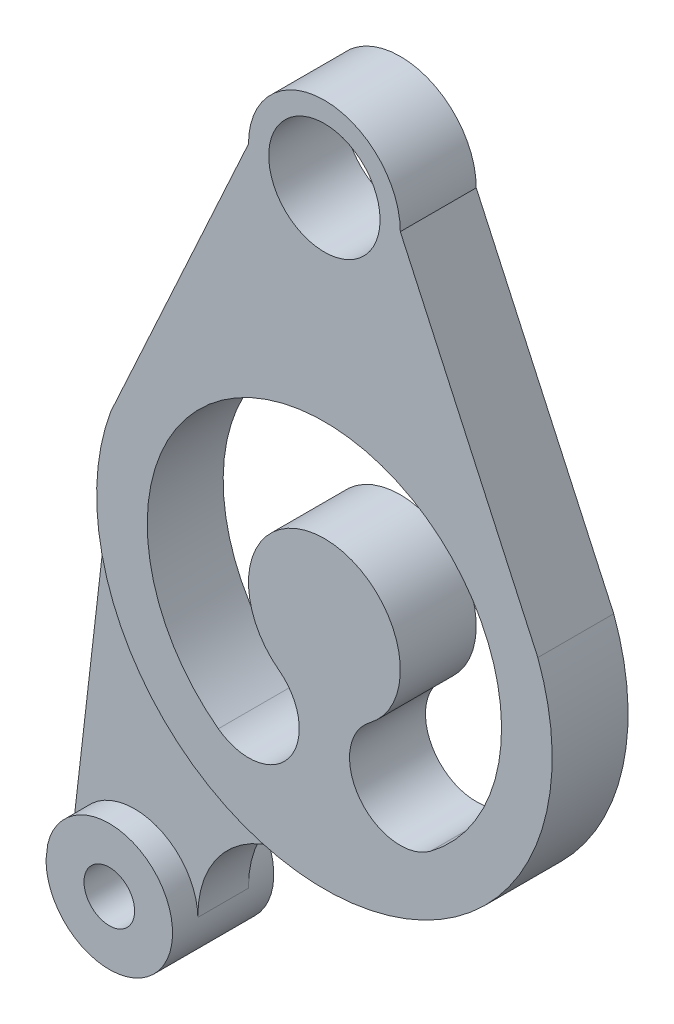
ISO-10303-21;
HEADER;
FILE_DESCRIPTION(('STEP AP214'),'2;1');
FILE_NAME('part.step','',(''),(''),'','','');
FILE_SCHEMA(('AUTOMOTIVE_DESIGN { 1 0 10303 214 1 1 1 1 }'));
ENDSEC;
DATA;
#1=APPLICATION_CONTEXT('core data for automotive mechanical design processes');
#2=APPLICATION_PROTOCOL_DEFINITION('international standard','automotive_design',2000,#1);
#3=PRODUCT_CONTEXT('',#1,'mechanical');
#4=PRODUCT('Part','Part','',(#3));
#5=PRODUCT_RELATED_PRODUCT_CATEGORY('part','',(#4));
#6=PRODUCT_DEFINITION_FORMATION('','',#4);
#7=PRODUCT_DEFINITION_CONTEXT('part definition',#1,'design');
#8=PRODUCT_DEFINITION('design','',#6,#7);
#9=PRODUCT_DEFINITION_SHAPE('','',#8);
#10=(LENGTH_UNIT() NAMED_UNIT(*) SI_UNIT(.MILLI.,.METRE.));
#11=(NAMED_UNIT(*) PLANE_ANGLE_UNIT() SI_UNIT($,.RADIAN.));
#12=(NAMED_UNIT(*) SI_UNIT($,.STERADIAN.) SOLID_ANGLE_UNIT());
#13=UNCERTAINTY_MEASURE_WITH_UNIT(LENGTH_MEASURE(1.E-05),#10,'distance_accuracy_value','');
#14=(GEOMETRIC_REPRESENTATION_CONTEXT(3) GLOBAL_UNCERTAINTY_ASSIGNED_CONTEXT((#13)) GLOBAL_UNIT_ASSIGNED_CONTEXT((#10,
#11,#12)) REPRESENTATION_CONTEXT('',''));
#15=CARTESIAN_POINT('',(0.,0.,0.));
#16=DIRECTION('',(0.,0.,1.));
#17=DIRECTION('',(1.,0.,0.));
#18=AXIS2_PLACEMENT_3D('',#15,#16,#17);
#19=CARTESIAN_POINT('',(0.,0.,-2.5));
#20=DIRECTION('',(0.,0.,1.));
#21=DIRECTION('',(1.,0.,0.));
#22=AXIS2_PLACEMENT_3D('',#19,#20,#21);
#23=PLANE('',#22);
#24=DIRECTION('',(0.114624107985131,0.993408935871131,0.));
#25=VECTOR('',#24,1.);
#26=CARTESIAN_POINT('',(-44.4087591240876,5.12408759124088,-2.5));
#27=LINE('',#26,#25);
#28=CARTESIAN_POINT('',(-52.1715328467153,-62.1532846715329,-2.5));
#29=VERTEX_POINT('',#28);
#30=CARTESIAN_POINT('',(-45.,-3.13984949151802E-13,-2.5));
#31=VERTEX_POINT('',#30);
#32=EDGE_CURVE('E56',#29,#31,#27,.T.);
#33=ORIENTED_EDGE('',*,*,#32,.F.);
#34=CARTESIAN_POINT('',(-40.,-65.,-2.5));
#35=DIRECTION('',(0.,0.,1.));
#36=DIRECTION('',(1.,0.,0.));
#37=AXIS2_PLACEMENT_3D('',#34,#35,#36);
#38=CIRCLE('',#37,12.5);
#39=CARTESIAN_POINT('',(-27.5011170470002,-64.8328924681182,-2.5));
#40=VERTEX_POINT('',#39);
#41=EDGE_CURVE('E49',#29,#40,#38,.F.);
#42=ORIENTED_EDGE('',*,*,#41,.T.);
#43=CARTESIAN_POINT('',(-7.50290432220056,-64.5655204171073,-2.5));
#44=DIRECTION('',(0.,0.,1.));
#45=DIRECTION('',(1.,0.,0.));
#46=AXIS2_PLACEMENT_3D('',#43,#44,#45);
#47=CIRCLE('',#46,20.);
#48=CARTESIAN_POINT('',(-7.50290432220063,-44.5655204171073,-2.5));
#49=VERTEX_POINT('',#48);
#50=EDGE_CURVE('E188',#49,#40,#47,.T.);
#51=ORIENTED_EDGE('',*,*,#50,.F.);
#52=CARTESIAN_POINT('',(1.20879681928067,0.822087972648714,-2.5));
#53=DIRECTION('',(0.,0.,1.));
#54=DIRECTION('',(1.,0.,0.));
#55=AXIS2_PLACEMENT_3D('',#52,#53,#54);
#56=CIRCLE('',#55,46.2161090110401);
#57=CARTESIAN_POINT('',(-16.537644432832,-41.851001381248,-2.5));
#58=VERTEX_POINT('',#57);
#59=EDGE_CURVE('E184',#58,#49,#56,.T.);
#60=ORIENTED_EDGE('',*,*,#59,.F.);
#61=CARTESIAN_POINT('',(0.,0.,-2.5));
#62=DIRECTION('',(0.,0.,1.));
#63=DIRECTION('',(1.,0.,0.));
#64=AXIS2_PLACEMENT_3D('',#61,#62,#63);
#65=CIRCLE('',#64,45.);
#66=EDGE_CURVE('E272',#58,#31,#65,.F.);
#67=ORIENTED_EDGE('',*,*,#66,.T.);
#68=EDGE_LOOP('',(#33,#42,#51,#60,#67));
#69=FACE_BOUND('',#68,.T.);
#70=ADVANCED_FACE('F41',(#69),#23,.T.);
#71=CARTESIAN_POINT('',(14.9688520765026,-20.023323088633,-15.));
#72=DIRECTION('',(0.,0.,1.));
#73=DIRECTION('',(1.,0.,0.));
#74=AXIS2_PLACEMENT_3D('',#71,#72,#73);
#75=CYLINDRICAL_SURFACE('',#74,10.);
#76=CARTESIAN_POINT('',(14.9688520765026,-20.023323088633,0.));
#77=DIRECTION('',(0.,0.,1.));
#78=DIRECTION('',(1.,0.,0.));
#79=AXIS2_PLACEMENT_3D('',#76,#77,#78);
#80=CIRCLE('',#79,10.);
#81=CARTESIAN_POINT('',(8.98131124590159,-12.0139938531798,0.));
#82=VERTEX_POINT('',#81);
#83=CARTESIAN_POINT('',(20.9563929071037,-28.0326523240862,0.));
#84=VERTEX_POINT('',#83);
#85=EDGE_CURVE('E237',#82,#84,#80,.T.);
#86=ORIENTED_EDGE('',*,*,#85,.T.);
#87=DIRECTION('',(0.,0.,1.));
#88=VECTOR('',#87,1.);
#89=CARTESIAN_POINT('',(20.9563929071037,-28.0326523240862,-15.));
#90=LINE('',#89,#88);
#91=CARTESIAN_POINT('',(20.9563929071037,-28.0326523240862,-15.));
#92=VERTEX_POINT('',#91);
#93=EDGE_CURVE('E250',#92,#84,#90,.T.);
#94=ORIENTED_EDGE('',*,*,#93,.F.);
#95=CARTESIAN_POINT('',(14.9688520765026,-20.023323088633,-15.));
#96=DIRECTION('',(0.,0.,1.));
#97=DIRECTION('',(1.,0.,0.));
#98=AXIS2_PLACEMENT_3D('',#95,#96,#97);
#99=CIRCLE('',#98,10.);
#100=CARTESIAN_POINT('',(8.98131124590159,-12.0139938531798,-15.));
#101=VERTEX_POINT('',#100);
#102=EDGE_CURVE('E212',#101,#92,#99,.T.);
#103=ORIENTED_EDGE('',*,*,#102,.F.);
#104=DIRECTION('',(0.,0.,1.));
#105=VECTOR('',#104,1.);
#106=CARTESIAN_POINT('',(8.98131124590159,-12.0139938531798,-15.));
#107=LINE('',#106,#105);
#108=EDGE_CURVE('E259',#101,#82,#107,.T.);
#109=ORIENTED_EDGE('',*,*,#108,.T.);
#110=EDGE_LOOP('',(#86,#94,#103,#109));
#111=FACE_BOUND('',#110,.T.);
#112=ADVANCED_FACE('F294',(#111),#75,.F.);
#113=CARTESIAN_POINT('',(0.,0.,-15.));
#114=DIRECTION('',(0.,0.,1.));
#115=DIRECTION('',(1.,0.,0.));
#116=AXIS2_PLACEMENT_3D('',#113,#114,#115);
#117=CYLINDRICAL_SURFACE('',#116,35.);
#118=CARTESIAN_POINT('',(0.,0.,0.));
#119=DIRECTION('',(0.,0.,1.));
#120=DIRECTION('',(1.,0.,0.));
#121=AXIS2_PLACEMENT_3D('',#118,#119,#120);
#122=CIRCLE('',#121,35.);
#123=CARTESIAN_POINT('',(-20.9563929071037,-28.0326523240862,0.));
#124=VERTEX_POINT('',#123);
#125=EDGE_CURVE('E246',#84,#124,#122,.T.);
#126=ORIENTED_EDGE('',*,*,#125,.T.);
#127=DIRECTION('',(0.,0.,1.));
#128=VECTOR('',#127,1.);
#129=CARTESIAN_POINT('',(-20.9563929071037,-28.0326523240862,-15.));
#130=LINE('',#129,#128);
#131=CARTESIAN_POINT('',(-20.9563929071037,-28.0326523240862,-15.));
#132=VERTEX_POINT('',#131);
#133=EDGE_CURVE('E254',#132,#124,#130,.T.);
#134=ORIENTED_EDGE('',*,*,#133,.F.);
#135=CARTESIAN_POINT('',(0.,0.,-15.));
#136=DIRECTION('',(0.,0.,1.));
#137=DIRECTION('',(1.,0.,0.));
#138=AXIS2_PLACEMENT_3D('',#135,#136,#137);
#139=CIRCLE('',#138,35.);
#140=EDGE_CURVE('E220',#92,#132,#139,.T.);
#141=ORIENTED_EDGE('',*,*,#140,.F.);
#142=ORIENTED_EDGE('',*,*,#93,.T.);
#143=EDGE_LOOP('',(#126,#134,#141,#142));
#144=FACE_BOUND('',#143,.T.);
#145=ADVANCED_FACE('F298',(#144),#117,.F.);
#146=CARTESIAN_POINT('',(-14.9688520765027,-20.023323088633,-15.));
#147=DIRECTION('',(0.,0.,1.));
#148=DIRECTION('',(1.,0.,0.));
#149=AXIS2_PLACEMENT_3D('',#146,#147,#148);
#150=CYLINDRICAL_SURFACE('',#149,10.);
#151=CARTESIAN_POINT('',(-14.9688520765027,-20.023323088633,0.));
#152=DIRECTION('',(0.,0.,1.));
#153=DIRECTION('',(1.,0.,0.));
#154=AXIS2_PLACEMENT_3D('',#151,#152,#153);
#155=CIRCLE('',#154,10.);
#156=CARTESIAN_POINT('',(-8.9813112459016,-12.0139938531798,0.));
#157=VERTEX_POINT('',#156);
#158=EDGE_CURVE('E243',#124,#157,#155,.T.);
#159=ORIENTED_EDGE('',*,*,#158,.T.);
#160=DIRECTION('',(0.,0.,1.));
#161=VECTOR('',#160,1.);
#162=CARTESIAN_POINT('',(-8.9813112459016,-12.0139938531798,-15.));
#163=LINE('',#162,#161);
#164=CARTESIAN_POINT('',(-8.9813112459016,-12.0139938531798,-15.));
#165=VERTEX_POINT('',#164);
#166=EDGE_CURVE('E257',#165,#157,#163,.T.);
#167=ORIENTED_EDGE('',*,*,#166,.F.);
#168=CARTESIAN_POINT('',(-14.9688520765027,-20.023323088633,-15.));
#169=DIRECTION('',(0.,0.,1.));
#170=DIRECTION('',(1.,0.,0.));
#171=AXIS2_PLACEMENT_3D('',#168,#169,#170);
#172=CIRCLE('',#171,10.);
#173=EDGE_CURVE('E218',#132,#165,#172,.T.);
#174=ORIENTED_EDGE('',*,*,#173,.F.);
#175=ORIENTED_EDGE('',*,*,#133,.T.);
#176=EDGE_LOOP('',(#159,#167,#174,#175));
#177=FACE_BOUND('',#176,.T.);
#178=ADVANCED_FACE('F332',(#177),#150,.F.);
#179=CARTESIAN_POINT('',(40.8004115170069,18.6962080207742,-15.));
#180=DIRECTION('',(-0.909098414199667,-0.416581412571002,0.));
#181=DIRECTION('',(0.416581412571002,-0.909098414199667,0.));
#182=AXIS2_PLACEMENT_3D('',#179,#180,#181);
#183=PLANE('',#182);
#184=DIRECTION('',(0.416581412571002,-0.909098414199667,0.));
#185=VECTOR('',#184,1.);
#186=CARTESIAN_POINT('',(40.8004115170069,18.6962080207742,0.));
#187=LINE('',#186,#185);
#188=CARTESIAN_POINT('',(15.,75.,0.));
#189=VERTEX_POINT('',#188);
#190=CARTESIAN_POINT('',(42.1680569665783,15.7116190019808,0.));
#191=VERTEX_POINT('',#190);
#192=EDGE_CURVE('E199',#189,#191,#187,.T.);
#193=ORIENTED_EDGE('',*,*,#192,.T.);
#194=DIRECTION('',(0.,0.,1.));
#195=VECTOR('',#194,1.);
#196=CARTESIAN_POINT('',(42.1680569665783,15.7116190019808,-15.));
#197=LINE('',#196,#195);
#198=CARTESIAN_POINT('',(42.1680569665783,15.7116190019808,-15.));
#199=VERTEX_POINT('',#198);
#200=EDGE_CURVE('E261',#199,#191,#197,.T.);
#201=ORIENTED_EDGE('',*,*,#200,.F.);
#202=DIRECTION('',(0.416581412571002,-0.909098414199667,0.));
#203=VECTOR('',#202,1.);
#204=CARTESIAN_POINT('',(40.8004115170069,18.6962080207742,-15.));
#205=LINE('',#204,#203);
#206=CARTESIAN_POINT('',(15.,75.,-15.));
#207=VERTEX_POINT('',#206);
#208=EDGE_CURVE('E200',#207,#199,#205,.T.);
#209=ORIENTED_EDGE('',*,*,#208,.F.);
#210=DIRECTION('',(0.,0.,1.));
#211=VECTOR('',#210,1.);
#212=CARTESIAN_POINT('',(15.,75.,-15.));
#213=LINE('',#212,#211);
#214=EDGE_CURVE('E225',#207,#189,#213,.T.);
#215=ORIENTED_EDGE('',*,*,#214,.T.);
#216=EDGE_LOOP('',(#193,#201,#209,#215));
#217=FACE_BOUND('',#216,.T.);
#218=ADVANCED_FACE('F43',(#217),#183,.F.);
#219=CARTESIAN_POINT('',(0.,0.,-15.));
#220=DIRECTION('',(0.,0.,1.));
#221=DIRECTION('',(1.,0.,0.));
#222=AXIS2_PLACEMENT_3D('',#219,#220,#221);
#223=CYLINDRICAL_SURFACE('',#222,45.);
#224=ORIENTED_EDGE('',*,*,#66,.F.);
#225=DIRECTION('',(0.,0.,-1.));
#226=VECTOR('',#225,1.);
#227=CARTESIAN_POINT('',(-16.537644432832,-41.851001381248,-7.5));
#228=LINE('',#227,#226);
#229=CARTESIAN_POINT('',(-16.537644432832,-41.851001381248,-12.5));
#230=VERTEX_POINT('',#229);
#231=EDGE_CURVE('E270',#230,#58,#228,.F.);
#232=ORIENTED_EDGE('',*,*,#231,.F.);
#233=CARTESIAN_POINT('',(0.,0.,-12.5));
#234=DIRECTION('',(0.,0.,1.));
#235=DIRECTION('',(1.,0.,0.));
#236=AXIS2_PLACEMENT_3D('',#233,#234,#235);
#237=CIRCLE('',#236,45.);
#238=CARTESIAN_POINT('',(-45.,-6.52364447184528E-13,-12.5));
#239=VERTEX_POINT('',#238);
#240=EDGE_CURVE('E253',#230,#239,#237,.F.);
#241=ORIENTED_EDGE('',*,*,#240,.T.);
#242=DIRECTION('',(0.,0.,-1.));
#243=VECTOR('',#242,1.);
#244=CARTESIAN_POINT('',(-45.,-3.13984949151802E-13,-2.5));
#245=LINE('',#244,#243);
#246=EDGE_CURVE('E159',#31,#239,#245,.T.);
#247=ORIENTED_EDGE('',*,*,#246,.F.);
#248=EDGE_LOOP('',(#224,#232,#241,#247));
#249=FACE_BOUND('',#248,.T.);
#250=CARTESIAN_POINT('',(0.,0.,0.));
#251=DIRECTION('',(0.,0.,1.));
#252=DIRECTION('',(1.,0.,0.));
#253=AXIS2_PLACEMENT_3D('',#250,#251,#252);
#254=CIRCLE('',#253,45.);
#255=CARTESIAN_POINT('',(-42.1680569665783,15.7116190019808,0.));
#256=VERTEX_POINT('',#255);
#257=EDGE_CURVE('E234',#256,#191,#254,.T.);
#258=ORIENTED_EDGE('',*,*,#257,.F.);
#259=DIRECTION('',(0.,0.,1.));
#260=VECTOR('',#259,1.);
#261=CARTESIAN_POINT('',(-42.1680569665783,15.7116190019808,-15.));
#262=LINE('',#261,#260);
#263=CARTESIAN_POINT('',(-42.1680569665783,15.7116190019808,-15.));
#264=VERTEX_POINT('',#263);
#265=EDGE_CURVE('E263',#264,#256,#262,.T.);
#266=ORIENTED_EDGE('',*,*,#265,.F.);
#267=CARTESIAN_POINT('',(0.,0.,-15.));
#268=DIRECTION('',(0.,0.,1.));
#269=DIRECTION('',(1.,0.,0.));
#270=AXIS2_PLACEMENT_3D('',#267,#268,#269);
#271=CIRCLE('',#270,45.);
#272=EDGE_CURVE('E209',#264,#199,#271,.T.);
#273=ORIENTED_EDGE('',*,*,#272,.T.);
#274=ORIENTED_EDGE('',*,*,#200,.T.);
#275=EDGE_LOOP('',(#258,#266,#273,#274));
#276=FACE_BOUND('',#275,.T.);
#277=ADVANCED_FACE('F342',(#249,#276),#223,.T.);
#278=CARTESIAN_POINT('',(-40.8004115170069,18.6962080207742,-15.));
#279=DIRECTION('',(-0.909098414199667,0.416581412571002,0.));
#280=DIRECTION('',(-0.416581412571002,-0.909098414199667,0.));
#281=AXIS2_PLACEMENT_3D('',#278,#279,#280);
#282=PLANE('',#281);
#283=DIRECTION('',(-0.416581412571002,-0.909098414199667,0.));
#284=VECTOR('',#283,1.);
#285=CARTESIAN_POINT('',(-40.8004115170069,18.6962080207742,0.));
#286=LINE('',#285,#284);
#287=CARTESIAN_POINT('',(-15.,75.,0.));
#288=VERTEX_POINT('',#287);
#289=EDGE_CURVE('E231',#288,#256,#286,.T.);
#290=ORIENTED_EDGE('',*,*,#289,.F.);
#291=DIRECTION('',(0.,0.,1.));
#292=VECTOR('',#291,1.);
#293=CARTESIAN_POINT('',(-15.,75.,-15.));
#294=LINE('',#293,#292);
#295=CARTESIAN_POINT('',(-15.,75.,-15.));
#296=VERTEX_POINT('',#295);
#297=EDGE_CURVE('E265',#296,#288,#294,.T.);
#298=ORIENTED_EDGE('',*,*,#297,.F.);
#299=DIRECTION('',(-0.416581412571002,-0.909098414199667,0.));
#300=VECTOR('',#299,1.);
#301=CARTESIAN_POINT('',(-40.8004115170069,18.6962080207742,-15.));
#302=LINE('',#301,#300);
#303=EDGE_CURVE('E206',#296,#264,#302,.T.);
#304=ORIENTED_EDGE('',*,*,#303,.T.);
#305=ORIENTED_EDGE('',*,*,#265,.T.);
#306=EDGE_LOOP('',(#290,#298,#304,#305));
#307=FACE_BOUND('',#306,.T.);
#308=ADVANCED_FACE('F339',(#307),#282,.T.);
#309=CARTESIAN_POINT('',(0.,0.,-15.));
#310=DIRECTION('',(0.,0.,1.));
#311=DIRECTION('',(1.,0.,0.));
#312=AXIS2_PLACEMENT_3D('',#309,#310,#311);
#313=CYLINDRICAL_SURFACE('',#312,15.);
#314=CARTESIAN_POINT('',(0.,0.,0.));
#315=DIRECTION('',(0.,0.,1.));
#316=DIRECTION('',(1.,0.,0.));
#317=AXIS2_PLACEMENT_3D('',#314,#315,#316);
#318=CIRCLE('',#317,15.);
#319=EDGE_CURVE('E240',#82,#157,#318,.T.);
#320=ORIENTED_EDGE('',*,*,#319,.F.);
#321=ORIENTED_EDGE('',*,*,#108,.F.);
#322=CARTESIAN_POINT('',(0.,0.,-15.));
#323=DIRECTION('',(0.,0.,1.));
#324=DIRECTION('',(1.,0.,0.));
#325=AXIS2_PLACEMENT_3D('',#322,#323,#324);
#326=CIRCLE('',#325,15.);
#327=EDGE_CURVE('E215',#101,#165,#326,.T.);
#328=ORIENTED_EDGE('',*,*,#327,.T.);
#329=ORIENTED_EDGE('',*,*,#166,.T.);
#330=EDGE_LOOP('',(#320,#321,#328,#329));
#331=FACE_BOUND('',#330,.T.);
#332=ADVANCED_FACE('F337',(#331),#313,.T.);
#333=CARTESIAN_POINT('',(0.,75.,-15.));
#334=DIRECTION('',(0.,0.,1.));
#335=DIRECTION('',(1.,0.,0.));
#336=AXIS2_PLACEMENT_3D('',#333,#334,#335);
#337=CYLINDRICAL_SURFACE('',#336,15.);
#338=CARTESIAN_POINT('',(0.,75.,0.));
#339=DIRECTION('',(0.,0.,1.));
#340=DIRECTION('',(1.,0.,0.));
#341=AXIS2_PLACEMENT_3D('',#338,#339,#340);
#342=CIRCLE('',#341,15.);
#343=EDGE_CURVE('E228',#189,#288,#342,.T.);
#344=ORIENTED_EDGE('',*,*,#343,.F.);
#345=ORIENTED_EDGE('',*,*,#214,.F.);
#346=CARTESIAN_POINT('',(0.,75.,-15.));
#347=DIRECTION('',(0.,0.,1.));
#348=DIRECTION('',(1.,0.,0.));
#349=AXIS2_PLACEMENT_3D('',#346,#347,#348);
#350=CIRCLE('',#349,15.);
#351=EDGE_CURVE('E202',#207,#296,#350,.T.);
#352=ORIENTED_EDGE('',*,*,#351,.T.);
#353=ORIENTED_EDGE('',*,*,#297,.T.);
#354=EDGE_LOOP('',(#344,#345,#352,#353));
#355=FACE_BOUND('',#354,.T.);
#356=ADVANCED_FACE('F328',(#355),#337,.T.);
#357=CARTESIAN_POINT('',(0.,75.,-15.));
#358=DIRECTION('',(0.,0.,1.));
#359=DIRECTION('',(1.,0.,0.));
#360=AXIS2_PLACEMENT_3D('',#357,#358,#359);
#361=CYLINDRICAL_SURFACE('',#360,11.);
#362=CARTESIAN_POINT('',(0.,75.,-15.));
#363=DIRECTION('',(0.,0.,1.));
#364=DIRECTION('',(1.,0.,0.));
#365=AXIS2_PLACEMENT_3D('',#362,#363,#364);
#366=CIRCLE('',#365,11.);
#367=CARTESIAN_POINT('',(11.,75.,-15.));
#368=VERTEX_POINT('',#367);
#369=EDGE_CURVE('E222',#368,#368,#366,.T.);
#370=ORIENTED_EDGE('',*,*,#369,.F.);
#371=EDGE_LOOP('',(#370));
#372=FACE_BOUND('',#371,.T.);
#373=CARTESIAN_POINT('',(0.,75.,0.));
#374=DIRECTION('',(0.,0.,1.));
#375=DIRECTION('',(1.,0.,0.));
#376=AXIS2_PLACEMENT_3D('',#373,#374,#375);
#377=CIRCLE('',#376,11.);
#378=CARTESIAN_POINT('',(11.,75.,0.));
#379=VERTEX_POINT('',#378);
#380=EDGE_CURVE('E203',#379,#379,#377,.T.);
#381=ORIENTED_EDGE('',*,*,#380,.T.);
#382=EDGE_LOOP('',(#381));
#383=FACE_BOUND('',#382,.T.);
#384=ADVANCED_FACE('F321',(#372,#383),#361,.F.);
#385=CARTESIAN_POINT('',(0.,0.,-15.));
#386=DIRECTION('',(0.,0.,1.));
#387=DIRECTION('',(1.,0.,0.));
#388=AXIS2_PLACEMENT_3D('',#385,#386,#387);
#389=PLANE('',#388);
#390=ORIENTED_EDGE('',*,*,#208,.T.);
#391=ORIENTED_EDGE('',*,*,#272,.F.);
#392=ORIENTED_EDGE('',*,*,#303,.F.);
#393=ORIENTED_EDGE('',*,*,#351,.F.);
#394=EDGE_LOOP('',(#390,#391,#392,#393));
#395=FACE_BOUND('',#394,.T.);
#396=ORIENTED_EDGE('',*,*,#102,.T.);
#397=ORIENTED_EDGE('',*,*,#140,.T.);
#398=ORIENTED_EDGE('',*,*,#173,.T.);
#399=ORIENTED_EDGE('',*,*,#327,.F.);
#400=EDGE_LOOP('',(#396,#397,#398,#399));
#401=FACE_BOUND('',#400,.T.);
#402=ORIENTED_EDGE('',*,*,#369,.T.);
#403=EDGE_LOOP('',(#402));
#404=FACE_BOUND('',#403,.T.);
#405=ADVANCED_FACE('F318',(#395,#401,#404),#389,.F.);
#406=CARTESIAN_POINT('',(0.,0.,0.));
#407=DIRECTION('',(0.,0.,1.));
#408=DIRECTION('',(1.,0.,0.));
#409=AXIS2_PLACEMENT_3D('',#406,#407,#408);
#410=PLANE('',#409);
#411=ORIENTED_EDGE('',*,*,#192,.F.);
#412=ORIENTED_EDGE('',*,*,#343,.T.);
#413=ORIENTED_EDGE('',*,*,#289,.T.);
#414=ORIENTED_EDGE('',*,*,#257,.T.);
#415=EDGE_LOOP('',(#411,#412,#413,#414));
#416=FACE_BOUND('',#415,.T.);
#417=ORIENTED_EDGE('',*,*,#85,.F.);
#418=ORIENTED_EDGE('',*,*,#319,.T.);
#419=ORIENTED_EDGE('',*,*,#158,.F.);
#420=ORIENTED_EDGE('',*,*,#125,.F.);
#421=EDGE_LOOP('',(#417,#418,#419,#420));
#422=FACE_BOUND('',#421,.T.);
#423=ORIENTED_EDGE('',*,*,#380,.F.);
#424=EDGE_LOOP('',(#423));
#425=FACE_BOUND('',#424,.T.);
#426=ADVANCED_FACE('F316',(#416,#422,#425),#410,.T.);
#427=CARTESIAN_POINT('',(1.20879681928067,0.822087972648714,-2.5));
#428=DIRECTION('',(0.,0.,-1.));
#429=DIRECTION('',(-1.,0.,0.));
#430=AXIS2_PLACEMENT_3D('',#427,#428,#429);
#431=CYLINDRICAL_SURFACE('',#430,46.2161090110401);
#432=CARTESIAN_POINT('',(1.20879681928067,0.822087972648714,-12.5));
#433=DIRECTION('',(0.,0.,1.));
#434=DIRECTION('',(1.,0.,0.));
#435=AXIS2_PLACEMENT_3D('',#432,#433,#434);
#436=CIRCLE('',#435,46.2161090110401);
#437=CARTESIAN_POINT('',(-7.50290432220063,-44.5655204171073,-12.5));
#438=VERTEX_POINT('',#437);
#439=EDGE_CURVE('E183',#230,#438,#436,.T.);
#440=ORIENTED_EDGE('',*,*,#439,.F.);
#441=ORIENTED_EDGE('',*,*,#231,.T.);
#442=ORIENTED_EDGE('',*,*,#59,.T.);
#443=DIRECTION('',(0.,0.,-1.));
#444=VECTOR('',#443,1.);
#445=CARTESIAN_POINT('',(-7.50290432220063,-44.5655204171073,-2.5));
#446=LINE('',#445,#444);
#447=EDGE_CURVE('E190',#49,#438,#446,.T.);
#448=ORIENTED_EDGE('',*,*,#447,.T.);
#449=EDGE_LOOP('',(#440,#441,#442,#448));
#450=FACE_BOUND('',#449,.T.);
#451=ADVANCED_FACE('F313',(#450),#431,.F.);
#452=CARTESIAN_POINT('',(-44.4087591240876,5.12408759124088,-2.5));
#453=DIRECTION('',(-0.993408935871131,0.114624107985131,0.));
#454=DIRECTION('',(-0.114624107985131,-0.993408935871131,0.));
#455=AXIS2_PLACEMENT_3D('',#452,#453,#454);
#456=PLANE('',#455);
#457=DIRECTION('',(0.114624107985131,0.993408935871131,0.));
#458=VECTOR('',#457,1.);
#459=CARTESIAN_POINT('',(-44.4087591240876,5.12408759124088,-12.5));
#460=LINE('',#459,#458);
#461=CARTESIAN_POINT('',(-52.1715328467153,-62.1532846715329,-12.5));
#462=VERTEX_POINT('',#461);
#463=EDGE_CURVE('E63',#462,#239,#460,.T.);
#464=ORIENTED_EDGE('',*,*,#463,.F.);
#465=DIRECTION('',(0.,0.,1.));
#466=VECTOR('',#465,1.);
#467=CARTESIAN_POINT('',(-52.1715328467153,-62.1532846715329,-17.5));
#468=LINE('',#467,#466);
#469=CARTESIAN_POINT('',(-52.1715328467153,-62.1532846715329,-17.5));
#470=VERTEX_POINT('',#469);
#471=EDGE_CURVE('E165',#470,#462,#468,.T.);
#472=ORIENTED_EDGE('',*,*,#471,.F.);
#473=DIRECTION('',(0.114624107985131,0.993408935871131,0.));
#474=VECTOR('',#473,1.);
#475=CARTESIAN_POINT('',(-44.4087591240876,5.12408759124088,-17.5));
#476=LINE('',#475,#474);
#477=CARTESIAN_POINT('',(-52.5,-65.,-17.5));
#478=VERTEX_POINT('',#477);
#479=EDGE_CURVE('E163',#478,#470,#476,.T.);
#480=ORIENTED_EDGE('',*,*,#479,.F.);
#481=DIRECTION('',(0.,0.,-1.));
#482=VECTOR('',#481,1.);
#483=CARTESIAN_POINT('',(-52.5,-65.,-2.5));
#484=LINE('',#483,#482);
#485=CARTESIAN_POINT('',(-52.5,-65.,2.5));
#486=VERTEX_POINT('',#485);
#487=EDGE_CURVE('E149',#486,#478,#484,.T.);
#488=ORIENTED_EDGE('',*,*,#487,.F.);
#489=DIRECTION('',(0.114624107985131,0.993408935871131,0.));
#490=VECTOR('',#489,1.);
#491=CARTESIAN_POINT('',(-44.4087591240876,5.12408759124088,2.5));
#492=LINE('',#491,#490);
#493=CARTESIAN_POINT('',(-52.1715328467153,-62.1532846715329,2.5));
#494=VERTEX_POINT('',#493);
#495=EDGE_CURVE('E177',#486,#494,#492,.T.);
#496=ORIENTED_EDGE('',*,*,#495,.T.);
#497=DIRECTION('',(0.,0.,-1.));
#498=VECTOR('',#497,1.);
#499=CARTESIAN_POINT('',(-52.1715328467153,-62.1532846715329,2.5));
#500=LINE('',#499,#498);
#501=EDGE_CURVE('E180',#494,#29,#500,.T.);
#502=ORIENTED_EDGE('',*,*,#501,.T.);
#503=ORIENTED_EDGE('',*,*,#32,.T.);
#504=ORIENTED_EDGE('',*,*,#246,.T.);
#505=EDGE_LOOP('',(#464,#472,#480,#488,#496,#502,#503,#504));
#506=FACE_BOUND('',#505,.T.);
#507=ADVANCED_FACE('F164',(#506),#456,.T.);
#508=CARTESIAN_POINT('',(-40.,-65.,-2.5));
#509=DIRECTION('',(0.,0.,-1.));
#510=DIRECTION('',(-1.,0.,0.));
#511=AXIS2_PLACEMENT_3D('',#508,#509,#510);
#512=CYLINDRICAL_SURFACE('',#511,12.5);
#513=ORIENTED_EDGE('',*,*,#487,.T.);
#514=CARTESIAN_POINT('',(-40.,-65.,-17.5));
#515=DIRECTION('',(0.,0.,1.));
#516=DIRECTION('',(1.,0.,0.));
#517=AXIS2_PLACEMENT_3D('',#514,#515,#516);
#518=CIRCLE('',#517,12.5);
#519=EDGE_CURVE('E153',#478,#470,#518,.T.);
#520=ORIENTED_EDGE('',*,*,#519,.T.);
#521=ORIENTED_EDGE('',*,*,#471,.T.);
#522=CARTESIAN_POINT('',(-40.,-65.,-12.5));
#523=DIRECTION('',(0.,0.,1.));
#524=DIRECTION('',(1.,0.,0.));
#525=AXIS2_PLACEMENT_3D('',#522,#523,#524);
#526=CIRCLE('',#525,12.5);
#527=CARTESIAN_POINT('',(-27.5011170470002,-64.8328924681182,-12.5));
#528=VERTEX_POINT('',#527);
#529=EDGE_CURVE('E11',#528,#462,#526,.T.);
#530=ORIENTED_EDGE('',*,*,#529,.F.);
#531=DIRECTION('',(0.,0.,-1.));
#532=VECTOR('',#531,1.);
#533=CARTESIAN_POINT('',(-27.5011170470002,-64.8328924681182,-2.5));
#534=LINE('',#533,#532);
#535=EDGE_CURVE('E160',#40,#528,#534,.T.);
#536=ORIENTED_EDGE('',*,*,#535,.F.);
#537=ORIENTED_EDGE('',*,*,#41,.F.);
#538=ORIENTED_EDGE('',*,*,#501,.F.);
#539=CARTESIAN_POINT('',(-40.,-65.,2.5));
#540=DIRECTION('',(0.,0.,1.));
#541=DIRECTION('',(1.,0.,0.));
#542=AXIS2_PLACEMENT_3D('',#539,#540,#541);
#543=CIRCLE('',#542,12.5);
#544=EDGE_CURVE('E155',#486,#494,#543,.T.);
#545=ORIENTED_EDGE('',*,*,#544,.F.);
#546=EDGE_LOOP('',(#513,#520,#521,#530,#536,#537,#538,#545));
#547=FACE_BOUND('',#546,.T.);
#548=ADVANCED_FACE('F151',(#547),#512,.T.);
#549=CARTESIAN_POINT('',(-7.50290432220056,-64.5655204171073,-2.5));
#550=DIRECTION('',(0.,0.,-1.));
#551=DIRECTION('',(-1.,0.,0.));
#552=AXIS2_PLACEMENT_3D('',#549,#550,#551);
#553=CYLINDRICAL_SURFACE('',#552,20.);
#554=CARTESIAN_POINT('',(-7.50290432220056,-64.5655204171073,-12.5));
#555=DIRECTION('',(0.,0.,1.));
#556=DIRECTION('',(1.,0.,0.));
#557=AXIS2_PLACEMENT_3D('',#554,#555,#556);
#558=CIRCLE('',#557,20.);
#559=EDGE_CURVE('E186',#438,#528,#558,.T.);
#560=ORIENTED_EDGE('',*,*,#559,.F.);
#561=ORIENTED_EDGE('',*,*,#447,.F.);
#562=ORIENTED_EDGE('',*,*,#50,.T.);
#563=ORIENTED_EDGE('',*,*,#535,.T.);
#564=EDGE_LOOP('',(#560,#561,#562,#563));
#565=FACE_BOUND('',#564,.T.);
#566=ADVANCED_FACE('F304',(#565),#553,.F.);
#567=CARTESIAN_POINT('',(-40.,-65.,-2.5));
#568=DIRECTION('',(0.,0.,-1.));
#569=DIRECTION('',(-1.,0.,0.));
#570=AXIS2_PLACEMENT_3D('',#567,#568,#569);
#571=CYLINDRICAL_SURFACE('',#570,5.00000000000001);
#572=CARTESIAN_POINT('',(-40.,-65.,2.5));
#573=DIRECTION('',(0.,0.,1.));
#574=DIRECTION('',(1.,0.,0.));
#575=AXIS2_PLACEMENT_3D('',#572,#573,#574);
#576=CIRCLE('',#575,5.00000000000001);
#577=CARTESIAN_POINT('',(-35.,-65.,2.5));
#578=VERTEX_POINT('',#577);
#579=EDGE_CURVE('E171',#578,#578,#576,.T.);
#580=ORIENTED_EDGE('',*,*,#579,.T.);
#581=EDGE_LOOP('',(#580));
#582=FACE_BOUND('',#581,.T.);
#583=CARTESIAN_POINT('',(-40.,-65.,-17.5));
#584=DIRECTION('',(0.,0.,1.));
#585=DIRECTION('',(1.,0.,0.));
#586=AXIS2_PLACEMENT_3D('',#583,#584,#585);
#587=CIRCLE('',#586,5.00000000000001);
#588=CARTESIAN_POINT('',(-35.,-65.,-17.5));
#589=VERTEX_POINT('',#588);
#590=EDGE_CURVE('E167',#589,#589,#587,.T.);
#591=ORIENTED_EDGE('',*,*,#590,.F.);
#592=EDGE_LOOP('',(#591));
#593=FACE_BOUND('',#592,.T.);
#594=ADVANCED_FACE('F289',(#582,#593),#571,.F.);
#595=CARTESIAN_POINT('',(0.,0.,-12.5));
#596=DIRECTION('',(0.,0.,1.));
#597=DIRECTION('',(1.,0.,0.));
#598=AXIS2_PLACEMENT_3D('',#595,#596,#597);
#599=PLANE('',#598);
#600=ORIENTED_EDGE('',*,*,#559,.T.);
#601=ORIENTED_EDGE('',*,*,#529,.T.);
#602=ORIENTED_EDGE('',*,*,#463,.T.);
#603=ORIENTED_EDGE('',*,*,#240,.F.);
#604=ORIENTED_EDGE('',*,*,#439,.T.);
#605=EDGE_LOOP('',(#600,#601,#602,#603,#604));
#606=FACE_BOUND('',#605,.T.);
#607=ADVANCED_FACE('F280',(#606),#599,.F.);
#608=CARTESIAN_POINT('',(0.,0.,2.5));
#609=DIRECTION('',(0.,0.,1.));
#610=DIRECTION('',(1.,0.,0.));
#611=AXIS2_PLACEMENT_3D('',#608,#609,#610);
#612=PLANE('',#611);
#613=ORIENTED_EDGE('',*,*,#579,.F.);
#614=EDGE_LOOP('',(#613));
#615=FACE_BOUND('',#614,.T.);
#616=ORIENTED_EDGE('',*,*,#495,.F.);
#617=ORIENTED_EDGE('',*,*,#544,.T.);
#618=EDGE_LOOP('',(#616,#617));
#619=FACE_BOUND('',#618,.T.);
#620=ADVANCED_FACE('F278',(#615,#619),#612,.T.);
#621=CARTESIAN_POINT('',(0.,0.,-17.5));
#622=DIRECTION('',(0.,0.,1.));
#623=DIRECTION('',(1.,0.,0.));
#624=AXIS2_PLACEMENT_3D('',#621,#622,#623);
#625=PLANE('',#624);
#626=ORIENTED_EDGE('',*,*,#590,.T.);
#627=EDGE_LOOP('',(#626));
#628=FACE_BOUND('',#627,.T.);
#629=ORIENTED_EDGE('',*,*,#479,.T.);
#630=ORIENTED_EDGE('',*,*,#519,.F.);
#631=EDGE_LOOP('',(#629,#630));
#632=FACE_BOUND('',#631,.T.);
#633=ADVANCED_FACE('F169',(#628,#632),#625,.F.);
#634=CLOSED_SHELL('',(#70,#112,#145,#178,#218,#277,#308,#332,#356,#384,#405,#426,#451,#507,#548,
#566,#594,#607,#620,#633));
#635=MANIFOLD_SOLID_BREP('B2',#634);
#636=ADVANCED_BREP_SHAPE_REPRESENTATION('',(#18,#635),#14);
#637=SHAPE_DEFINITION_REPRESENTATION(#9,#636);
ENDSEC;
END-ISO-10303-21;
